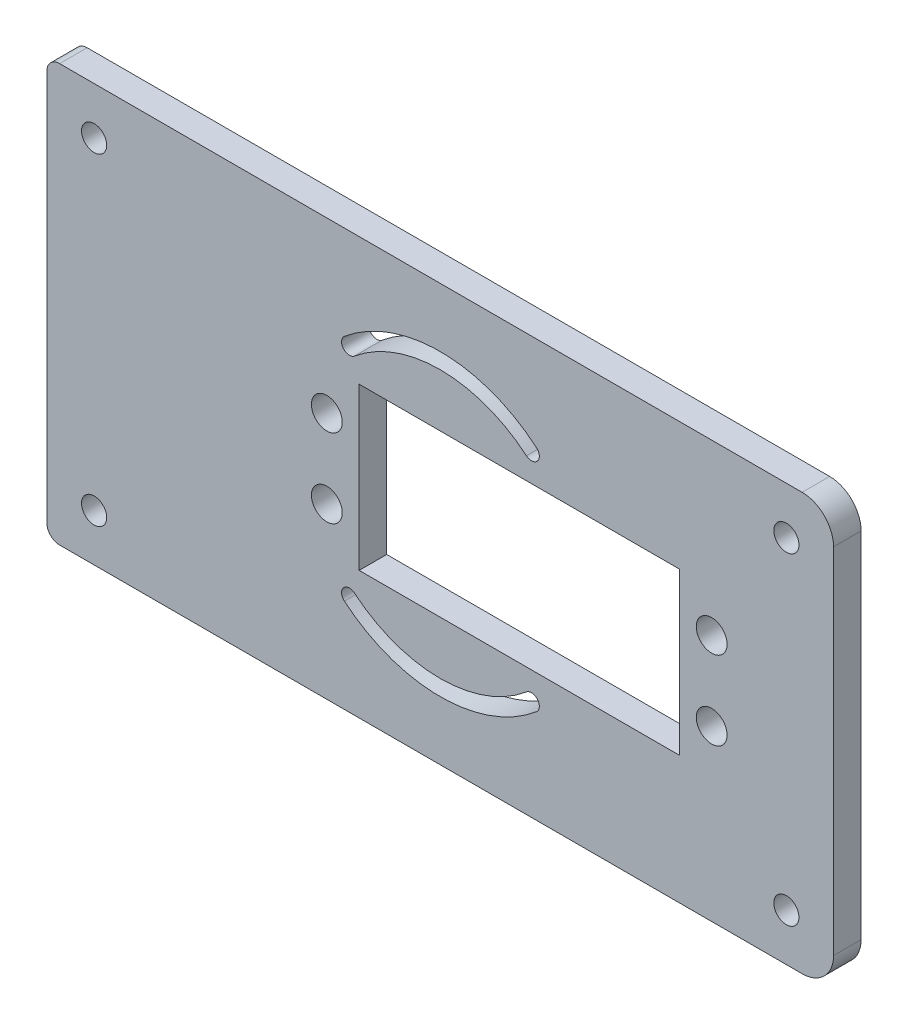
ISO-10303-21;
HEADER;
FILE_DESCRIPTION(('STEP AP214'),'2;1');
FILE_NAME('part.step','',(''),(''),'','','');
FILE_SCHEMA(('AUTOMOTIVE_DESIGN { 1 0 10303 214 1 1 1 1 }'));
ENDSEC;
DATA;
#1=APPLICATION_CONTEXT('core data for automotive mechanical design processes');
#2=APPLICATION_PROTOCOL_DEFINITION('international standard','automotive_design',2000,#1);
#3=PRODUCT_CONTEXT('',#1,'mechanical');
#4=PRODUCT('Part','Part','',(#3));
#5=PRODUCT_RELATED_PRODUCT_CATEGORY('part','',(#4));
#6=PRODUCT_DEFINITION_FORMATION('','',#4);
#7=PRODUCT_DEFINITION_CONTEXT('part definition',#1,'design');
#8=PRODUCT_DEFINITION('design','',#6,#7);
#9=PRODUCT_DEFINITION_SHAPE('','',#8);
#10=(LENGTH_UNIT() NAMED_UNIT(*) SI_UNIT(.MILLI.,.METRE.));
#11=(NAMED_UNIT(*) PLANE_ANGLE_UNIT() SI_UNIT($,.RADIAN.));
#12=(NAMED_UNIT(*) SI_UNIT($,.STERADIAN.) SOLID_ANGLE_UNIT());
#13=UNCERTAINTY_MEASURE_WITH_UNIT(LENGTH_MEASURE(1.E-05),#10,'distance_accuracy_value','');
#14=(GEOMETRIC_REPRESENTATION_CONTEXT(3) GLOBAL_UNCERTAINTY_ASSIGNED_CONTEXT((#13)) GLOBAL_UNIT_ASSIGNED_CONTEXT((#10,
#11,#12)) REPRESENTATION_CONTEXT('',''));
#15=CARTESIAN_POINT('',(0.,0.,0.));
#16=DIRECTION('',(0.,0.,1.));
#17=DIRECTION('',(1.,0.,0.));
#18=AXIS2_PLACEMENT_3D('',#15,#16,#17);
#19=CARTESIAN_POINT('',(-0.0442005485762831,0.,3.5));
#20=DIRECTION('',(0.,0.,-1.));
#21=DIRECTION('',(-1.,0.,0.));
#22=AXIS2_PLACEMENT_3D('',#19,#20,#21);
#23=CYLINDRICAL_SURFACE('',#22,19.);
#24=CARTESIAN_POINT('',(-0.0442005485762831,0.,0.));
#25=DIRECTION('',(0.,0.,1.));
#26=DIRECTION('',(1.,0.,0.));
#27=AXIS2_PLACEMENT_3D('',#24,#25,#26);
#28=CIRCLE('',#27,19.);
#29=CARTESIAN_POINT('',(-12.2297645811815,14.5777923296801,0.));
#30=VERTEX_POINT('',#29);
#31=CARTESIAN_POINT('',(12.1961213713889,14.5318450065922,0.));
#32=VERTEX_POINT('',#31);
#33=EDGE_CURVE('E274',#30,#32,#28,.F.);
#34=ORIENTED_EDGE('',*,*,#33,.T.);
#35=DIRECTION('',(0.,0.,-1.));
#36=VECTOR('',#35,1.);
#37=CARTESIAN_POINT('',(12.1961213713889,14.5318450065922,3.5));
#38=LINE('',#37,#36);
#39=CARTESIAN_POINT('',(12.1961213713889,14.5318450065922,3.5));
#40=VERTEX_POINT('',#39);
#41=EDGE_CURVE('E11',#40,#32,#38,.T.);
#42=ORIENTED_EDGE('',*,*,#41,.F.);
#43=CARTESIAN_POINT('',(-0.0442005485762831,0.,3.5));
#44=DIRECTION('',(0.,0.,1.));
#45=DIRECTION('',(1.,0.,0.));
#46=AXIS2_PLACEMENT_3D('',#43,#44,#45);
#47=CIRCLE('',#46,19.);
#48=CARTESIAN_POINT('',(-12.2297645811815,14.5777923296801,3.5));
#49=VERTEX_POINT('',#48);
#50=EDGE_CURVE('E185',#49,#40,#47,.F.);
#51=ORIENTED_EDGE('',*,*,#50,.F.);
#52=DIRECTION('',(0.,0.,-1.));
#53=VECTOR('',#52,1.);
#54=CARTESIAN_POINT('',(-12.2297645811815,14.5777923296801,3.5));
#55=LINE('',#54,#53);
#56=EDGE_CURVE('E288',#49,#30,#55,.T.);
#57=ORIENTED_EDGE('',*,*,#56,.T.);
#58=EDGE_LOOP('',(#34,#42,#51,#57));
#59=FACE_BOUND('',#58,.T.);
#60=ADVANCED_FACE('F35',(#59),#23,.F.);
#61=CARTESIAN_POINT('',(11.5518939019171,13.7670110588768,3.5));
#62=DIRECTION('',(0.,0.,-1.));
#63=DIRECTION('',(-1.,0.,0.));
#64=AXIS2_PLACEMENT_3D('',#61,#62,#63);
#65=CYLINDRICAL_SURFACE('',#64,1.00000000000001);
#66=CARTESIAN_POINT('',(11.5518939019171,13.7670110588768,0.));
#67=DIRECTION('',(0.,0.,1.));
#68=DIRECTION('',(1.,0.,0.));
#69=AXIS2_PLACEMENT_3D('',#66,#67,#68);
#70=CIRCLE('',#69,1.00000000000001);
#71=CARTESIAN_POINT('',(10.9076664324452,13.0021771111615,0.));
#72=VERTEX_POINT('',#71);
#73=EDGE_CURVE('E191',#32,#72,#70,.F.);
#74=ORIENTED_EDGE('',*,*,#73,.T.);
#75=DIRECTION('',(0.,0.,-1.));
#76=VECTOR('',#75,1.);
#77=CARTESIAN_POINT('',(10.9076664324452,13.0021771111615,3.5));
#78=LINE('',#77,#76);
#79=CARTESIAN_POINT('',(10.9076664324452,13.0021771111615,3.5));
#80=VERTEX_POINT('',#79);
#81=EDGE_CURVE('E45',#80,#72,#78,.T.);
#82=ORIENTED_EDGE('',*,*,#81,.F.);
#83=CARTESIAN_POINT('',(11.5518939019171,13.7670110588768,3.5));
#84=DIRECTION('',(0.,0.,1.));
#85=DIRECTION('',(1.,0.,0.));
#86=AXIS2_PLACEMENT_3D('',#83,#84,#85);
#87=CIRCLE('',#86,1.00000000000001);
#88=EDGE_CURVE('E178',#40,#80,#87,.F.);
#89=ORIENTED_EDGE('',*,*,#88,.F.);
#90=ORIENTED_EDGE('',*,*,#41,.T.);
#91=EDGE_LOOP('',(#74,#82,#89,#90));
#92=FACE_BOUND('',#91,.T.);
#93=ADVANCED_FACE('F190',(#92),#65,.F.);
#94=CARTESIAN_POINT('',(-0.0442005485762831,0.,3.5));
#95=DIRECTION('',(0.,0.,-1.));
#96=DIRECTION('',(-1.,0.,0.));
#97=AXIS2_PLACEMENT_3D('',#94,#95,#96);
#98=CYLINDRICAL_SURFACE('',#97,17.);
#99=CARTESIAN_POINT('',(-0.0442005485762831,0.,0.));
#100=DIRECTION('',(0.,0.,1.));
#101=DIRECTION('',(1.,0.,0.));
#102=AXIS2_PLACEMENT_3D('',#99,#100,#101);
#103=CIRCLE('',#102,17.);
#104=CARTESIAN_POINT('',(-10.9470736303809,13.0432878739243,0.));
#105=VERTEX_POINT('',#104);
#106=EDGE_CURVE('E278',#105,#72,#103,.F.);
#107=ORIENTED_EDGE('',*,*,#106,.F.);
#108=DIRECTION('',(0.,0.,-1.));
#109=VECTOR('',#108,1.);
#110=CARTESIAN_POINT('',(-10.9470736303809,13.0432878739243,3.5));
#111=LINE('',#110,#109);
#112=CARTESIAN_POINT('',(-10.9470736303809,13.0432878739243,3.5));
#113=VERTEX_POINT('',#112);
#114=EDGE_CURVE('E118',#113,#105,#111,.T.);
#115=ORIENTED_EDGE('',*,*,#114,.F.);
#116=CARTESIAN_POINT('',(-0.0442005485762831,0.,3.5));
#117=DIRECTION('',(0.,0.,1.));
#118=DIRECTION('',(1.,0.,0.));
#119=AXIS2_PLACEMENT_3D('',#116,#117,#118);
#120=CIRCLE('',#119,17.);
#121=EDGE_CURVE('E183',#113,#80,#120,.F.);
#122=ORIENTED_EDGE('',*,*,#121,.T.);
#123=ORIENTED_EDGE('',*,*,#81,.T.);
#124=EDGE_LOOP('',(#107,#115,#122,#123));
#125=FACE_BOUND('',#124,.T.);
#126=ADVANCED_FACE('F196',(#125),#98,.T.);
#127=CARTESIAN_POINT('',(0.,10.24910129856,3.5));
#128=DIRECTION('',(0.,1.,0.));
#129=DIRECTION('',(0.,0.,1.));
#130=AXIS2_PLACEMENT_3D('',#127,#128,#129);
#131=PLANE('',#130);
#132=DIRECTION('',(1.,0.,0.));
#133=VECTOR('',#132,1.);
#134=CARTESIAN_POINT('',(0.,10.24910129856,0.));
#135=LINE('',#134,#133);
#136=CARTESIAN_POINT('',(-10.349101298564,10.24910129856,0.));
#137=VERTEX_POINT('',#136);
#138=CARTESIAN_POINT('',(30.34910129856,10.24910129856,0.));
#139=VERTEX_POINT('',#138);
#140=EDGE_CURVE('E262',#137,#139,#135,.T.);
#141=ORIENTED_EDGE('',*,*,#140,.T.);
#142=DIRECTION('',(0.,0.,-1.));
#143=VECTOR('',#142,1.);
#144=CARTESIAN_POINT('',(30.34910129856,10.24910129856,3.5));
#145=LINE('',#144,#143);
#146=CARTESIAN_POINT('',(30.34910129856,10.24910129856,3.5));
#147=VERTEX_POINT('',#146);
#148=EDGE_CURVE('E290',#147,#139,#145,.T.);
#149=ORIENTED_EDGE('',*,*,#148,.F.);
#150=DIRECTION('',(1.,0.,0.));
#151=VECTOR('',#150,1.);
#152=CARTESIAN_POINT('',(0.,10.24910129856,3.5));
#153=LINE('',#152,#151);
#154=CARTESIAN_POINT('',(-10.349101298564,10.24910129856,3.5));
#155=VERTEX_POINT('',#154);
#156=EDGE_CURVE('E384',#155,#147,#153,.T.);
#157=ORIENTED_EDGE('',*,*,#156,.F.);
#158=DIRECTION('',(0.,0.,-1.));
#159=VECTOR('',#158,1.);
#160=CARTESIAN_POINT('',(-10.349101298564,10.24910129856,3.5));
#161=LINE('',#160,#159);
#162=EDGE_CURVE('E292',#155,#137,#161,.T.);
#163=ORIENTED_EDGE('',*,*,#162,.T.);
#164=EDGE_LOOP('',(#141,#149,#157,#163));
#165=FACE_BOUND('',#164,.T.);
#166=ADVANCED_FACE('F410',(#165),#131,.F.);
#167=CARTESIAN_POINT('',(30.34910129856,0.,3.5));
#168=DIRECTION('',(1.,0.,0.));
#169=DIRECTION('',(0.,0.,-1.));
#170=AXIS2_PLACEMENT_3D('',#167,#168,#169);
#171=PLANE('',#170);
#172=DIRECTION('',(0.,-1.,0.));
#173=VECTOR('',#172,1.);
#174=CARTESIAN_POINT('',(30.34910129856,0.,0.));
#175=LINE('',#174,#173);
#176=CARTESIAN_POINT('',(30.34910129856,-10.249101298564,0.));
#177=VERTEX_POINT('',#176);
#178=EDGE_CURVE('E265',#139,#177,#175,.T.);
#179=ORIENTED_EDGE('',*,*,#178,.T.);
#180=DIRECTION('',(0.,0.,-1.));
#181=VECTOR('',#180,1.);
#182=CARTESIAN_POINT('',(30.34910129856,-10.249101298564,3.5));
#183=LINE('',#182,#181);
#184=CARTESIAN_POINT('',(30.34910129856,-10.249101298564,3.5));
#185=VERTEX_POINT('',#184);
#186=EDGE_CURVE('E297',#185,#177,#183,.T.);
#187=ORIENTED_EDGE('',*,*,#186,.F.);
#188=DIRECTION('',(0.,-1.,0.));
#189=VECTOR('',#188,1.);
#190=CARTESIAN_POINT('',(30.34910129856,0.,3.5));
#191=LINE('',#190,#189);
#192=EDGE_CURVE('E387',#147,#185,#191,.T.);
#193=ORIENTED_EDGE('',*,*,#192,.F.);
#194=ORIENTED_EDGE('',*,*,#148,.T.);
#195=EDGE_LOOP('',(#179,#187,#193,#194));
#196=FACE_BOUND('',#195,.T.);
#197=ADVANCED_FACE('F412',(#196),#171,.F.);
#198=CARTESIAN_POINT('',(0.,-10.249101298564,3.5));
#199=DIRECTION('',(0.,1.,0.));
#200=DIRECTION('',(0.,0.,1.));
#201=AXIS2_PLACEMENT_3D('',#198,#199,#200);
#202=PLANE('',#201);
#203=DIRECTION('',(1.,0.,0.));
#204=VECTOR('',#203,1.);
#205=CARTESIAN_POINT('',(0.,-10.249101298564,0.));
#206=LINE('',#205,#204);
#207=CARTESIAN_POINT('',(-10.349101298564,-10.249101298564,0.));
#208=VERTEX_POINT('',#207);
#209=EDGE_CURVE('E268',#208,#177,#206,.T.);
#210=ORIENTED_EDGE('',*,*,#209,.F.);
#211=DIRECTION('',(0.,0.,-1.));
#212=VECTOR('',#211,1.);
#213=CARTESIAN_POINT('',(-10.349101298564,-10.249101298564,3.5));
#214=LINE('',#213,#212);
#215=CARTESIAN_POINT('',(-10.349101298564,-10.249101298564,3.5));
#216=VERTEX_POINT('',#215);
#217=EDGE_CURVE('E294',#216,#208,#214,.T.);
#218=ORIENTED_EDGE('',*,*,#217,.F.);
#219=DIRECTION('',(1.,0.,0.));
#220=VECTOR('',#219,1.);
#221=CARTESIAN_POINT('',(0.,-10.249101298564,3.5));
#222=LINE('',#221,#220);
#223=EDGE_CURVE('E389',#216,#185,#222,.T.);
#224=ORIENTED_EDGE('',*,*,#223,.T.);
#225=ORIENTED_EDGE('',*,*,#186,.T.);
#226=EDGE_LOOP('',(#210,#218,#224,#225));
#227=FACE_BOUND('',#226,.T.);
#228=ADVANCED_FACE('F405',(#227),#202,.T.);
#229=CARTESIAN_POINT('',(11.5518939019171,-13.7670110588768,3.5));
#230=DIRECTION('',(0.,0.,-1.));
#231=DIRECTION('',(-1.,0.,0.));
#232=AXIS2_PLACEMENT_3D('',#229,#230,#231);
#233=CYLINDRICAL_SURFACE('',#232,1.);
#234=CARTESIAN_POINT('',(11.5518939019171,-13.7670110588768,0.));
#235=DIRECTION('',(0.,0.,1.));
#236=DIRECTION('',(1.,0.,0.));
#237=AXIS2_PLACEMENT_3D('',#234,#235,#236);
#238=CIRCLE('',#237,1.);
#239=CARTESIAN_POINT('',(12.1961213713889,-14.5318450065922,0.));
#240=VERTEX_POINT('',#239);
#241=CARTESIAN_POINT('',(10.9076664324452,-13.0021771111615,0.));
#242=VERTEX_POINT('',#241);
#243=EDGE_CURVE('E238',#240,#242,#238,.T.);
#244=ORIENTED_EDGE('',*,*,#243,.F.);
#245=DIRECTION('',(0.,0.,-1.));
#246=VECTOR('',#245,1.);
#247=CARTESIAN_POINT('',(12.1961213713889,-14.5318450065922,3.5));
#248=LINE('',#247,#246);
#249=CARTESIAN_POINT('',(12.1961213713889,-14.5318450065922,3.5));
#250=VERTEX_POINT('',#249);
#251=EDGE_CURVE('E295',#250,#240,#248,.T.);
#252=ORIENTED_EDGE('',*,*,#251,.F.);
#253=CARTESIAN_POINT('',(11.5518939019171,-13.7670110588768,3.5));
#254=DIRECTION('',(0.,0.,1.));
#255=DIRECTION('',(1.,0.,0.));
#256=AXIS2_PLACEMENT_3D('',#253,#254,#255);
#257=CIRCLE('',#256,1.);
#258=CARTESIAN_POINT('',(10.9076664324452,-13.0021771111615,3.5));
#259=VERTEX_POINT('',#258);
#260=EDGE_CURVE('E361',#250,#259,#257,.T.);
#261=ORIENTED_EDGE('',*,*,#260,.T.);
#262=DIRECTION('',(0.,0.,-1.));
#263=VECTOR('',#262,1.);
#264=CARTESIAN_POINT('',(10.9076664324452,-13.0021771111615,3.5));
#265=LINE('',#264,#263);
#266=EDGE_CURVE('E301',#259,#242,#265,.T.);
#267=ORIENTED_EDGE('',*,*,#266,.T.);
#268=EDGE_LOOP('',(#244,#252,#261,#267));
#269=FACE_BOUND('',#268,.T.);
#270=ADVANCED_FACE('F419',(#269),#233,.F.);
#271=CARTESIAN_POINT('',(-0.0442005485762831,0.,3.5));
#272=DIRECTION('',(0.,0.,-1.));
#273=DIRECTION('',(-1.,0.,0.));
#274=AXIS2_PLACEMENT_3D('',#271,#272,#273);
#275=CYLINDRICAL_SURFACE('',#274,19.);
#276=CARTESIAN_POINT('',(-0.0442005485762831,0.,0.));
#277=DIRECTION('',(0.,0.,1.));
#278=DIRECTION('',(1.,0.,0.));
#279=AXIS2_PLACEMENT_3D('',#276,#277,#278);
#280=CIRCLE('',#279,19.);
#281=CARTESIAN_POINT('',(-12.2297645811815,-14.5777923296801,0.));
#282=VERTEX_POINT('',#281);
#283=EDGE_CURVE('E241',#282,#240,#280,.T.);
#284=ORIENTED_EDGE('',*,*,#283,.F.);
#285=DIRECTION('',(0.,0.,-1.));
#286=VECTOR('',#285,1.);
#287=CARTESIAN_POINT('',(-12.2297645811815,-14.5777923296801,3.5));
#288=LINE('',#287,#286);
#289=CARTESIAN_POINT('',(-12.2297645811815,-14.5777923296801,3.5));
#290=VERTEX_POINT('',#289);
#291=EDGE_CURVE('E305',#290,#282,#288,.T.);
#292=ORIENTED_EDGE('',*,*,#291,.F.);
#293=CARTESIAN_POINT('',(-0.0442005485762831,0.,3.5));
#294=DIRECTION('',(0.,0.,1.));
#295=DIRECTION('',(1.,0.,0.));
#296=AXIS2_PLACEMENT_3D('',#293,#294,#295);
#297=CIRCLE('',#296,19.);
#298=EDGE_CURVE('E364',#290,#250,#297,.T.);
#299=ORIENTED_EDGE('',*,*,#298,.T.);
#300=ORIENTED_EDGE('',*,*,#251,.T.);
#301=EDGE_LOOP('',(#284,#292,#299,#300));
#302=FACE_BOUND('',#301,.T.);
#303=ADVANCED_FACE('F478',(#302),#275,.F.);
#304=CARTESIAN_POINT('',(-11.5884191057812,-13.8105401018022,3.5));
#305=DIRECTION('',(0.,0.,-1.));
#306=DIRECTION('',(-1.,0.,0.));
#307=AXIS2_PLACEMENT_3D('',#304,#305,#306);
#308=CYLINDRICAL_SURFACE('',#307,1.);
#309=CARTESIAN_POINT('',(-11.5884191057812,-13.8105401018022,0.));
#310=DIRECTION('',(0.,0.,1.));
#311=DIRECTION('',(1.,0.,0.));
#312=AXIS2_PLACEMENT_3D('',#309,#310,#311);
#313=CIRCLE('',#312,1.);
#314=CARTESIAN_POINT('',(-10.9470736303809,-13.0432878739243,0.));
#315=VERTEX_POINT('',#314);
#316=EDGE_CURVE('E244',#315,#282,#313,.T.);
#317=ORIENTED_EDGE('',*,*,#316,.F.);
#318=DIRECTION('',(0.,0.,-1.));
#319=VECTOR('',#318,1.);
#320=CARTESIAN_POINT('',(-10.9470736303809,-13.0432878739243,3.5));
#321=LINE('',#320,#319);
#322=CARTESIAN_POINT('',(-10.9470736303809,-13.0432878739243,3.5));
#323=VERTEX_POINT('',#322);
#324=EDGE_CURVE('E303',#323,#315,#321,.T.);
#325=ORIENTED_EDGE('',*,*,#324,.F.);
#326=CARTESIAN_POINT('',(-11.5884191057812,-13.8105401018022,3.5));
#327=DIRECTION('',(0.,0.,1.));
#328=DIRECTION('',(1.,0.,0.));
#329=AXIS2_PLACEMENT_3D('',#326,#327,#328);
#330=CIRCLE('',#329,1.);
#331=EDGE_CURVE('E367',#323,#290,#330,.T.);
#332=ORIENTED_EDGE('',*,*,#331,.T.);
#333=ORIENTED_EDGE('',*,*,#291,.T.);
#334=EDGE_LOOP('',(#317,#325,#332,#333));
#335=FACE_BOUND('',#334,.T.);
#336=ADVANCED_FACE('F488',(#335),#308,.F.);
#337=CARTESIAN_POINT('',(45.9557994514237,-22.5,3.5));
#338=DIRECTION('',(0.,0.,-1.));
#339=DIRECTION('',(-1.,0.,0.));
#340=AXIS2_PLACEMENT_3D('',#337,#338,#339);
#341=CYLINDRICAL_SURFACE('',#340,4.);
#342=CARTESIAN_POINT('',(45.9557994514237,-22.5,0.));
#343=DIRECTION('',(0.,0.,1.));
#344=DIRECTION('',(1.,0.,0.));
#345=AXIS2_PLACEMENT_3D('',#342,#343,#344);
#346=CIRCLE('',#345,4.);
#347=CARTESIAN_POINT('',(49.9557994514237,-22.5,0.));
#348=VERTEX_POINT('',#347);
#349=CARTESIAN_POINT('',(45.9557994514237,-26.5,0.));
#350=VERTEX_POINT('',#349);
#351=EDGE_CURVE('E214',#348,#350,#346,.F.);
#352=ORIENTED_EDGE('',*,*,#351,.F.);
#353=DIRECTION('',(0.,0.,-1.));
#354=VECTOR('',#353,1.);
#355=CARTESIAN_POINT('',(49.9557994514237,-22.5,3.5));
#356=LINE('',#355,#354);
#357=CARTESIAN_POINT('',(49.9557994514237,-22.5,3.5));
#358=VERTEX_POINT('',#357);
#359=EDGE_CURVE('E39',#358,#348,#356,.T.);
#360=ORIENTED_EDGE('',*,*,#359,.F.);
#361=CARTESIAN_POINT('',(45.9557994514237,-22.5,3.5));
#362=DIRECTION('',(0.,0.,1.));
#363=DIRECTION('',(1.,0.,0.));
#364=AXIS2_PLACEMENT_3D('',#361,#362,#363);
#365=CIRCLE('',#364,4.);
#366=CARTESIAN_POINT('',(45.9557994514237,-26.5,3.5));
#367=VERTEX_POINT('',#366);
#368=EDGE_CURVE('E687',#358,#367,#365,.F.);
#369=ORIENTED_EDGE('',*,*,#368,.T.);
#370=DIRECTION('',(0.,0.,-1.));
#371=VECTOR('',#370,1.);
#372=CARTESIAN_POINT('',(45.9557994514237,-26.5,3.5));
#373=LINE('',#372,#371);
#374=EDGE_CURVE('E207',#367,#350,#373,.T.);
#375=ORIENTED_EDGE('',*,*,#374,.T.);
#376=EDGE_LOOP('',(#352,#360,#369,#375));
#377=FACE_BOUND('',#376,.T.);
#378=ADVANCED_FACE('F328',(#377),#341,.T.);
#379=CARTESIAN_POINT('',(49.9557994514237,0.,3.5));
#380=DIRECTION('',(1.,0.,0.));
#381=DIRECTION('',(0.,1.,0.));
#382=AXIS2_PLACEMENT_3D('',#379,#380,#381);
#383=PLANE('',#382);
#384=DIRECTION('',(0.,-1.,0.));
#385=VECTOR('',#384,1.);
#386=CARTESIAN_POINT('',(49.9557994514237,0.,0.));
#387=LINE('',#386,#385);
#388=CARTESIAN_POINT('',(49.9557994514237,22.5,0.));
#389=VERTEX_POINT('',#388);
#390=EDGE_CURVE('E217',#389,#348,#387,.T.);
#391=ORIENTED_EDGE('',*,*,#390,.F.);
#392=DIRECTION('',(0.,0.,-1.));
#393=VECTOR('',#392,1.);
#394=CARTESIAN_POINT('',(49.9557994514237,22.5,3.5));
#395=LINE('',#394,#393);
#396=CARTESIAN_POINT('',(49.9557994514237,22.5,3.5));
#397=VERTEX_POINT('',#396);
#398=EDGE_CURVE('E318',#397,#389,#395,.T.);
#399=ORIENTED_EDGE('',*,*,#398,.F.);
#400=DIRECTION('',(0.,-1.,0.));
#401=VECTOR('',#400,1.);
#402=CARTESIAN_POINT('',(49.9557994514237,0.,3.5));
#403=LINE('',#402,#401);
#404=EDGE_CURVE('E327',#397,#358,#403,.T.);
#405=ORIENTED_EDGE('',*,*,#404,.T.);
#406=ORIENTED_EDGE('',*,*,#359,.T.);
#407=EDGE_LOOP('',(#391,#399,#405,#406));
#408=FACE_BOUND('',#407,.T.);
#409=ADVANCED_FACE('F325',(#408),#383,.T.);
#410=CARTESIAN_POINT('',(45.9557994514237,22.5,3.5));
#411=DIRECTION('',(0.,0.,-1.));
#412=DIRECTION('',(-1.,0.,0.));
#413=AXIS2_PLACEMENT_3D('',#410,#411,#412);
#414=CYLINDRICAL_SURFACE('',#413,4.);
#415=CARTESIAN_POINT('',(45.9557994514237,22.5,0.));
#416=DIRECTION('',(0.,0.,1.));
#417=DIRECTION('',(1.,0.,0.));
#418=AXIS2_PLACEMENT_3D('',#415,#416,#417);
#419=CIRCLE('',#418,4.);
#420=CARTESIAN_POINT('',(45.9557994514237,26.5,0.));
#421=VERTEX_POINT('',#420);
#422=EDGE_CURVE('E220',#421,#389,#419,.F.);
#423=ORIENTED_EDGE('',*,*,#422,.F.);
#424=DIRECTION('',(0.,0.,-1.));
#425=VECTOR('',#424,1.);
#426=CARTESIAN_POINT('',(45.9557994514237,26.5,3.5));
#427=LINE('',#426,#425);
#428=CARTESIAN_POINT('',(45.9557994514237,26.5,3.5));
#429=VERTEX_POINT('',#428);
#430=EDGE_CURVE('E317',#429,#421,#427,.T.);
#431=ORIENTED_EDGE('',*,*,#430,.F.);
#432=CARTESIAN_POINT('',(45.9557994514237,22.5,3.5));
#433=DIRECTION('',(0.,0.,1.));
#434=DIRECTION('',(1.,0.,0.));
#435=AXIS2_PLACEMENT_3D('',#432,#433,#434);
#436=CIRCLE('',#435,4.);
#437=EDGE_CURVE('E338',#429,#397,#436,.F.);
#438=ORIENTED_EDGE('',*,*,#437,.T.);
#439=ORIENTED_EDGE('',*,*,#398,.T.);
#440=EDGE_LOOP('',(#423,#431,#438,#439));
#441=FACE_BOUND('',#440,.T.);
#442=ADVANCED_FACE('F336',(#441),#414,.T.);
#443=CARTESIAN_POINT('',(0.,26.5,3.5));
#444=DIRECTION('',(0.,1.,0.));
#445=DIRECTION('',(0.,0.,1.));
#446=AXIS2_PLACEMENT_3D('',#443,#444,#445);
#447=PLANE('',#446);
#448=DIRECTION('',(1.,0.,0.));
#449=VECTOR('',#448,1.);
#450=CARTESIAN_POINT('',(0.,26.5,0.));
#451=LINE('',#450,#449);
#452=CARTESIAN_POINT('',(-48.4290015311776,26.5,0.));
#453=VERTEX_POINT('',#452);
#454=EDGE_CURVE('E223',#453,#421,#451,.T.);
#455=ORIENTED_EDGE('',*,*,#454,.F.);
#456=DIRECTION('',(0.,0.,-1.));
#457=VECTOR('',#456,1.);
#458=CARTESIAN_POINT('',(-48.4290015311776,26.5,3.5));
#459=LINE('',#458,#457);
#460=CARTESIAN_POINT('',(-48.4290015311776,26.5,3.5));
#461=VERTEX_POINT('',#460);
#462=EDGE_CURVE('E315',#461,#453,#459,.T.);
#463=ORIENTED_EDGE('',*,*,#462,.F.);
#464=DIRECTION('',(1.,0.,0.));
#465=VECTOR('',#464,1.);
#466=CARTESIAN_POINT('',(0.,26.5,3.5));
#467=LINE('',#466,#465);
#468=EDGE_CURVE('E344',#461,#429,#467,.T.);
#469=ORIENTED_EDGE('',*,*,#468,.T.);
#470=ORIENTED_EDGE('',*,*,#430,.T.);
#471=EDGE_LOOP('',(#455,#463,#469,#470));
#472=FACE_BOUND('',#471,.T.);
#473=ADVANCED_FACE('F346',(#472),#447,.T.);
#474=CARTESIAN_POINT('',(-48.4290015311776,24.8848009826013,3.5));
#475=DIRECTION('',(0.,0.,-1.));
#476=DIRECTION('',(-1.,0.,0.));
#477=AXIS2_PLACEMENT_3D('',#474,#475,#476);
#478=CYLINDRICAL_SURFACE('',#477,1.61519901739871);
#479=CARTESIAN_POINT('',(-48.4290015311776,24.8848009826013,0.));
#480=DIRECTION('',(0.,0.,1.));
#481=DIRECTION('',(1.,0.,0.));
#482=AXIS2_PLACEMENT_3D('',#479,#480,#481);
#483=CIRCLE('',#482,1.61519901739871);
#484=CARTESIAN_POINT('',(-50.0442005485763,24.8848009826013,0.));
#485=VERTEX_POINT('',#484);
#486=EDGE_CURVE('E226',#453,#485,#483,.T.);
#487=ORIENTED_EDGE('',*,*,#486,.T.);
#488=DIRECTION('',(0.,0.,-1.));
#489=VECTOR('',#488,1.);
#490=CARTESIAN_POINT('',(-50.0442005485763,24.8848009826013,3.5));
#491=LINE('',#490,#489);
#492=CARTESIAN_POINT('',(-50.0442005485763,24.8848009826013,3.5));
#493=VERTEX_POINT('',#492);
#494=EDGE_CURVE('E313',#493,#485,#491,.T.);
#495=ORIENTED_EDGE('',*,*,#494,.F.);
#496=CARTESIAN_POINT('',(-48.4290015311776,24.8848009826013,3.5));
#497=DIRECTION('',(0.,0.,1.));
#498=DIRECTION('',(1.,0.,0.));
#499=AXIS2_PLACEMENT_3D('',#496,#497,#498);
#500=CIRCLE('',#499,1.61519901739871);
#501=EDGE_CURVE('E348',#461,#493,#500,.T.);
#502=ORIENTED_EDGE('',*,*,#501,.F.);
#503=ORIENTED_EDGE('',*,*,#462,.T.);
#504=EDGE_LOOP('',(#487,#495,#502,#503));
#505=FACE_BOUND('',#504,.T.);
#506=ADVANCED_FACE('F531',(#505),#478,.T.);
#507=CARTESIAN_POINT('',(-50.0442005485763,0.,3.5));
#508=DIRECTION('',(-1.,0.,0.));
#509=DIRECTION('',(0.,-1.,0.));
#510=AXIS2_PLACEMENT_3D('',#507,#508,#509);
#511=PLANE('',#510);
#512=DIRECTION('',(0.,1.,0.));
#513=VECTOR('',#512,1.);
#514=CARTESIAN_POINT('',(-50.0442005485763,0.,0.));
#515=LINE('',#514,#513);
#516=CARTESIAN_POINT('',(-50.0442005485763,-24.8848009826013,0.));
#517=VERTEX_POINT('',#516);
#518=EDGE_CURVE('E229',#517,#485,#515,.T.);
#519=ORIENTED_EDGE('',*,*,#518,.F.);
#520=DIRECTION('',(0.,0.,-1.));
#521=VECTOR('',#520,1.);
#522=CARTESIAN_POINT('',(-50.0442005485763,-24.8848009826013,3.5));
#523=LINE('',#522,#521);
#524=CARTESIAN_POINT('',(-50.0442005485763,-24.8848009826013,3.5));
#525=VERTEX_POINT('',#524);
#526=EDGE_CURVE('E311',#525,#517,#523,.T.);
#527=ORIENTED_EDGE('',*,*,#526,.F.);
#528=DIRECTION('',(0.,1.,0.));
#529=VECTOR('',#528,1.);
#530=CARTESIAN_POINT('',(-50.0442005485763,0.,3.5));
#531=LINE('',#530,#529);
#532=EDGE_CURVE('E350',#525,#493,#531,.T.);
#533=ORIENTED_EDGE('',*,*,#532,.T.);
#534=ORIENTED_EDGE('',*,*,#494,.T.);
#535=EDGE_LOOP('',(#519,#527,#533,#534));
#536=FACE_BOUND('',#535,.T.);
#537=ADVANCED_FACE('F540',(#536),#511,.T.);
#538=CARTESIAN_POINT('',(-48.4290015311776,-24.8848009826013,3.5));
#539=DIRECTION('',(0.,0.,-1.));
#540=DIRECTION('',(-1.,0.,0.));
#541=AXIS2_PLACEMENT_3D('',#538,#539,#540);
#542=CYLINDRICAL_SURFACE('',#541,1.61519901739871);
#543=CARTESIAN_POINT('',(-48.4290015311776,-24.8848009826013,0.));
#544=DIRECTION('',(0.,0.,1.));
#545=DIRECTION('',(1.,0.,0.));
#546=AXIS2_PLACEMENT_3D('',#543,#544,#545);
#547=CIRCLE('',#546,1.61519901739871);
#548=CARTESIAN_POINT('',(-48.4290015311776,-26.5,0.));
#549=VERTEX_POINT('',#548);
#550=EDGE_CURVE('E232',#549,#517,#547,.F.);
#551=ORIENTED_EDGE('',*,*,#550,.F.);
#552=DIRECTION('',(0.,0.,-1.));
#553=VECTOR('',#552,1.);
#554=CARTESIAN_POINT('',(-48.4290015311776,-26.5,3.5));
#555=LINE('',#554,#553);
#556=CARTESIAN_POINT('',(-48.4290015311776,-26.5,3.5));
#557=VERTEX_POINT('',#556);
#558=EDGE_CURVE('E309',#557,#549,#555,.T.);
#559=ORIENTED_EDGE('',*,*,#558,.F.);
#560=CARTESIAN_POINT('',(-48.4290015311776,-24.8848009826013,3.5));
#561=DIRECTION('',(0.,0.,1.));
#562=DIRECTION('',(1.,0.,0.));
#563=AXIS2_PLACEMENT_3D('',#560,#561,#562);
#564=CIRCLE('',#563,1.61519901739871);
#565=EDGE_CURVE('E356',#557,#525,#564,.F.);
#566=ORIENTED_EDGE('',*,*,#565,.T.);
#567=ORIENTED_EDGE('',*,*,#526,.T.);
#568=EDGE_LOOP('',(#551,#559,#566,#567));
#569=FACE_BOUND('',#568,.T.);
#570=ADVANCED_FACE('F446',(#569),#542,.T.);
#571=CARTESIAN_POINT('',(34.4620886384427,-5.,3.5));
#572=DIRECTION('',(0.,0.,-1.));
#573=DIRECTION('',(-1.,0.,0.));
#574=AXIS2_PLACEMENT_3D('',#571,#572,#573);
#575=CYLINDRICAL_SURFACE('',#574,1.96133809798307);
#576=CARTESIAN_POINT('',(34.4620886384427,-5.,3.5));
#577=DIRECTION('',(0.,0.,1.));
#578=DIRECTION('',(1.,0.,0.));
#579=AXIS2_PLACEMENT_3D('',#576,#577,#578);
#580=CIRCLE('',#579,1.96133809798307);
#581=CARTESIAN_POINT('',(36.4234267364258,-5.,3.5));
#582=VERTEX_POINT('',#581);
#583=EDGE_CURVE('E198',#582,#582,#580,.T.);
#584=ORIENTED_EDGE('',*,*,#583,.T.);
#585=EDGE_LOOP('',(#584));
#586=FACE_BOUND('',#585,.T.);
#587=CARTESIAN_POINT('',(34.4620886384427,-5.,0.));
#588=DIRECTION('',(0.,0.,1.));
#589=DIRECTION('',(1.,0.,0.));
#590=AXIS2_PLACEMENT_3D('',#587,#588,#589);
#591=CIRCLE('',#590,1.96133809798307);
#592=CARTESIAN_POINT('',(36.4234267364258,-5.,0.));
#593=VERTEX_POINT('',#592);
#594=EDGE_CURVE('E281',#593,#593,#591,.T.);
#595=ORIENTED_EDGE('',*,*,#594,.F.);
#596=EDGE_LOOP('',(#595));
#597=FACE_BOUND('',#596,.T.);
#598=ADVANCED_FACE('F441',(#586,#597),#575,.F.);
#599=CARTESIAN_POINT('',(-11.5884191057812,13.8105401018022,3.5));
#600=DIRECTION('',(0.,0.,-1.));
#601=DIRECTION('',(-1.,0.,0.));
#602=AXIS2_PLACEMENT_3D('',#599,#600,#601);
#603=CYLINDRICAL_SURFACE('',#602,0.999999999999996);
#604=CARTESIAN_POINT('',(-11.5884191057812,13.8105401018022,0.));
#605=DIRECTION('',(0.,0.,1.));
#606=DIRECTION('',(1.,0.,0.));
#607=AXIS2_PLACEMENT_3D('',#604,#605,#606);
#608=CIRCLE('',#607,0.999999999999996);
#609=EDGE_CURVE('E121',#105,#30,#608,.F.);
#610=ORIENTED_EDGE('',*,*,#609,.T.);
#611=ORIENTED_EDGE('',*,*,#56,.F.);
#612=CARTESIAN_POINT('',(-11.5884191057812,13.8105401018022,3.5));
#613=DIRECTION('',(0.,0.,1.));
#614=DIRECTION('',(1.,0.,0.));
#615=AXIS2_PLACEMENT_3D('',#612,#613,#614);
#616=CIRCLE('',#615,0.999999999999996);
#617=EDGE_CURVE('E54',#113,#49,#616,.F.);
#618=ORIENTED_EDGE('',*,*,#617,.F.);
#619=ORIENTED_EDGE('',*,*,#114,.T.);
#620=EDGE_LOOP('',(#610,#611,#618,#619));
#621=FACE_BOUND('',#620,.T.);
#622=ADVANCED_FACE('F433',(#621),#603,.F.);
#623=CARTESIAN_POINT('',(-10.349101298564,0.,3.5));
#624=DIRECTION('',(1.,0.,0.));
#625=DIRECTION('',(0.,0.,-1.));
#626=AXIS2_PLACEMENT_3D('',#623,#624,#625);
#627=PLANE('',#626);
#628=DIRECTION('',(0.,-1.,0.));
#629=VECTOR('',#628,1.);
#630=CARTESIAN_POINT('',(-10.349101298564,0.,0.));
#631=LINE('',#630,#629);
#632=EDGE_CURVE('E271',#137,#208,#631,.T.);
#633=ORIENTED_EDGE('',*,*,#632,.F.);
#634=ORIENTED_EDGE('',*,*,#162,.F.);
#635=DIRECTION('',(0.,-1.,0.));
#636=VECTOR('',#635,1.);
#637=CARTESIAN_POINT('',(-10.349101298564,0.,3.5));
#638=LINE('',#637,#636);
#639=EDGE_CURVE('E392',#155,#216,#638,.T.);
#640=ORIENTED_EDGE('',*,*,#639,.T.);
#641=ORIENTED_EDGE('',*,*,#217,.T.);
#642=EDGE_LOOP('',(#633,#634,#640,#641));
#643=FACE_BOUND('',#642,.T.);
#644=ADVANCED_FACE('F397',(#643),#627,.T.);
#645=CARTESIAN_POINT('',(43.9557994514237,-20.5,3.5));
#646=DIRECTION('',(0.,0.,-1.));
#647=DIRECTION('',(-1.,0.,0.));
#648=AXIS2_PLACEMENT_3D('',#645,#646,#647);
#649=CYLINDRICAL_SURFACE('',#648,1.6);
#650=CARTESIAN_POINT('',(43.9557994514237,-20.5,3.5));
#651=DIRECTION('',(0.,0.,1.));
#652=DIRECTION('',(1.,0.,0.));
#653=AXIS2_PLACEMENT_3D('',#650,#651,#652);
#654=CIRCLE('',#653,1.6);
#655=CARTESIAN_POINT('',(45.5557994514237,-20.5,3.5));
#656=VERTEX_POINT('',#655);
#657=EDGE_CURVE('E381',#656,#656,#654,.T.);
#658=ORIENTED_EDGE('',*,*,#657,.T.);
#659=EDGE_LOOP('',(#658));
#660=FACE_BOUND('',#659,.T.);
#661=CARTESIAN_POINT('',(43.9557994514237,-20.5,0.));
#662=DIRECTION('',(0.,0.,1.));
#663=DIRECTION('',(1.,0.,0.));
#664=AXIS2_PLACEMENT_3D('',#661,#662,#663);
#665=CIRCLE('',#664,1.6);
#666=CARTESIAN_POINT('',(45.5557994514237,-20.5,0.));
#667=VERTEX_POINT('',#666);
#668=EDGE_CURVE('E259',#667,#667,#665,.T.);
#669=ORIENTED_EDGE('',*,*,#668,.F.);
#670=EDGE_LOOP('',(#669));
#671=FACE_BOUND('',#670,.T.);
#672=ADVANCED_FACE('F432',(#660,#671),#649,.F.);
#673=CARTESIAN_POINT('',(43.9557994514237,20.5,3.5));
#674=DIRECTION('',(0.,0.,-1.));
#675=DIRECTION('',(-1.,0.,0.));
#676=AXIS2_PLACEMENT_3D('',#673,#674,#675);
#677=CYLINDRICAL_SURFACE('',#676,1.6);
#678=CARTESIAN_POINT('',(43.9557994514237,20.5,3.5));
#679=DIRECTION('',(0.,0.,1.));
#680=DIRECTION('',(1.,0.,0.));
#681=AXIS2_PLACEMENT_3D('',#678,#679,#680);
#682=CIRCLE('',#681,1.6);
#683=CARTESIAN_POINT('',(45.5557994514237,20.5,3.5));
#684=VERTEX_POINT('',#683);
#685=EDGE_CURVE('E378',#684,#684,#682,.T.);
#686=ORIENTED_EDGE('',*,*,#685,.T.);
#687=EDGE_LOOP('',(#686));
#688=FACE_BOUND('',#687,.T.);
#689=CARTESIAN_POINT('',(43.9557994514237,20.5,0.));
#690=DIRECTION('',(0.,0.,1.));
#691=DIRECTION('',(1.,0.,0.));
#692=AXIS2_PLACEMENT_3D('',#689,#690,#691);
#693=CIRCLE('',#692,1.6);
#694=CARTESIAN_POINT('',(45.5557994514237,20.5,0.));
#695=VERTEX_POINT('',#694);
#696=EDGE_CURVE('E256',#695,#695,#693,.T.);
#697=ORIENTED_EDGE('',*,*,#696,.F.);
#698=EDGE_LOOP('',(#697));
#699=FACE_BOUND('',#698,.T.);
#700=ADVANCED_FACE('F438',(#688,#699),#677,.F.);
#701=CARTESIAN_POINT('',(-44.0442005485763,20.5,3.5));
#702=DIRECTION('',(0.,0.,-1.));
#703=DIRECTION('',(-1.,0.,0.));
#704=AXIS2_PLACEMENT_3D('',#701,#702,#703);
#705=CYLINDRICAL_SURFACE('',#704,1.6);
#706=CARTESIAN_POINT('',(-44.0442005485763,20.5,3.5));
#707=DIRECTION('',(0.,0.,1.));
#708=DIRECTION('',(1.,0.,0.));
#709=AXIS2_PLACEMENT_3D('',#706,#707,#708);
#710=CIRCLE('',#709,1.6);
#711=CARTESIAN_POINT('',(-42.4442005485763,20.5,3.5));
#712=VERTEX_POINT('',#711);
#713=EDGE_CURVE('E375',#712,#712,#710,.T.);
#714=ORIENTED_EDGE('',*,*,#713,.T.);
#715=EDGE_LOOP('',(#714));
#716=FACE_BOUND('',#715,.T.);
#717=CARTESIAN_POINT('',(-44.0442005485763,20.5,0.));
#718=DIRECTION('',(0.,0.,1.));
#719=DIRECTION('',(1.,0.,0.));
#720=AXIS2_PLACEMENT_3D('',#717,#718,#719);
#721=CIRCLE('',#720,1.6);
#722=CARTESIAN_POINT('',(-42.4442005485763,20.5,0.));
#723=VERTEX_POINT('',#722);
#724=EDGE_CURVE('E253',#723,#723,#721,.T.);
#725=ORIENTED_EDGE('',*,*,#724,.F.);
#726=EDGE_LOOP('',(#725));
#727=FACE_BOUND('',#726,.T.);
#728=ADVANCED_FACE('F588',(#716,#727),#705,.F.);
#729=CARTESIAN_POINT('',(-44.0442005485763,-20.5,3.5));
#730=DIRECTION('',(0.,0.,-1.));
#731=DIRECTION('',(-1.,0.,0.));
#732=AXIS2_PLACEMENT_3D('',#729,#730,#731);
#733=CYLINDRICAL_SURFACE('',#732,1.6);
#734=CARTESIAN_POINT('',(-44.0442005485763,-20.5,3.5));
#735=DIRECTION('',(0.,0.,1.));
#736=DIRECTION('',(1.,0.,0.));
#737=AXIS2_PLACEMENT_3D('',#734,#735,#736);
#738=CIRCLE('',#737,1.6);
#739=CARTESIAN_POINT('',(-42.4442005485763,-20.5,3.5));
#740=VERTEX_POINT('',#739);
#741=EDGE_CURVE('E372',#740,#740,#738,.T.);
#742=ORIENTED_EDGE('',*,*,#741,.T.);
#743=EDGE_LOOP('',(#742));
#744=FACE_BOUND('',#743,.T.);
#745=CARTESIAN_POINT('',(-44.0442005485763,-20.5,0.));
#746=DIRECTION('',(0.,0.,1.));
#747=DIRECTION('',(1.,0.,0.));
#748=AXIS2_PLACEMENT_3D('',#745,#746,#747);
#749=CIRCLE('',#748,1.6);
#750=CARTESIAN_POINT('',(-42.4442005485763,-20.5,0.));
#751=VERTEX_POINT('',#750);
#752=EDGE_CURVE('E250',#751,#751,#749,.T.);
#753=ORIENTED_EDGE('',*,*,#752,.F.);
#754=EDGE_LOOP('',(#753));
#755=FACE_BOUND('',#754,.T.);
#756=ADVANCED_FACE('F598',(#744,#755),#733,.F.);
#757=CARTESIAN_POINT('',(-0.0442005485762831,0.,3.5));
#758=DIRECTION('',(0.,0.,-1.));
#759=DIRECTION('',(-1.,0.,0.));
#760=AXIS2_PLACEMENT_3D('',#757,#758,#759);
#761=CYLINDRICAL_SURFACE('',#760,17.);
#762=CARTESIAN_POINT('',(-0.0442005485762831,0.,0.));
#763=DIRECTION('',(0.,0.,1.));
#764=DIRECTION('',(1.,0.,0.));
#765=AXIS2_PLACEMENT_3D('',#762,#763,#764);
#766=CIRCLE('',#765,17.);
#767=EDGE_CURVE('E247',#315,#242,#766,.T.);
#768=ORIENTED_EDGE('',*,*,#767,.T.);
#769=ORIENTED_EDGE('',*,*,#266,.F.);
#770=CARTESIAN_POINT('',(-0.0442005485762831,0.,3.5));
#771=DIRECTION('',(0.,0.,1.));
#772=DIRECTION('',(1.,0.,0.));
#773=AXIS2_PLACEMENT_3D('',#770,#771,#772);
#774=CIRCLE('',#773,17.);
#775=EDGE_CURVE('E370',#323,#259,#774,.T.);
#776=ORIENTED_EDGE('',*,*,#775,.F.);
#777=ORIENTED_EDGE('',*,*,#324,.T.);
#778=EDGE_LOOP('',(#768,#769,#776,#777));
#779=FACE_BOUND('',#778,.T.);
#780=ADVANCED_FACE('F608',(#779),#761,.T.);
#781=CARTESIAN_POINT('',(0.,-26.5,3.5));
#782=DIRECTION('',(0.,1.,0.));
#783=DIRECTION('',(-1.,0.,0.));
#784=AXIS2_PLACEMENT_3D('',#781,#782,#783);
#785=PLANE('',#784);
#786=DIRECTION('',(1.,0.,0.));
#787=VECTOR('',#786,1.);
#788=CARTESIAN_POINT('',(0.,-26.5,0.));
#789=LINE('',#788,#787);
#790=EDGE_CURVE('E235',#549,#350,#789,.T.);
#791=ORIENTED_EDGE('',*,*,#790,.T.);
#792=ORIENTED_EDGE('',*,*,#374,.F.);
#793=DIRECTION('',(1.,0.,0.));
#794=VECTOR('',#793,1.);
#795=CARTESIAN_POINT('',(0.,-26.5,3.5));
#796=LINE('',#795,#794);
#797=EDGE_CURVE('E359',#557,#367,#796,.T.);
#798=ORIENTED_EDGE('',*,*,#797,.F.);
#799=ORIENTED_EDGE('',*,*,#558,.T.);
#800=EDGE_LOOP('',(#791,#792,#798,#799));
#801=FACE_BOUND('',#800,.T.);
#802=ADVANCED_FACE('F618',(#801),#785,.F.);
#803=CARTESIAN_POINT('',(-14.4620886384467,5.,3.5));
#804=DIRECTION('',(0.,0.,-1.));
#805=DIRECTION('',(-1.,0.,0.));
#806=AXIS2_PLACEMENT_3D('',#803,#804,#805);
#807=CYLINDRICAL_SURFACE('',#806,1.96133809798308);
#808=CARTESIAN_POINT('',(-14.4620886384467,5.,3.5));
#809=DIRECTION('',(0.,0.,1.));
#810=DIRECTION('',(1.,0.,0.));
#811=AXIS2_PLACEMENT_3D('',#808,#809,#810);
#812=CIRCLE('',#811,1.96133809798308);
#813=CARTESIAN_POINT('',(-12.5007505404637,5.,3.5));
#814=VERTEX_POINT('',#813);
#815=EDGE_CURVE('E686',#814,#814,#812,.T.);
#816=ORIENTED_EDGE('',*,*,#815,.T.);
#817=EDGE_LOOP('',(#816));
#818=FACE_BOUND('',#817,.T.);
#819=CARTESIAN_POINT('',(-14.4620886384467,5.,0.));
#820=DIRECTION('',(0.,0.,1.));
#821=DIRECTION('',(1.,0.,0.));
#822=AXIS2_PLACEMENT_3D('',#819,#820,#821);
#823=CIRCLE('',#822,1.96133809798308);
#824=CARTESIAN_POINT('',(-12.5007505404637,5.,0.));
#825=VERTEX_POINT('',#824);
#826=EDGE_CURVE('E211',#825,#825,#823,.T.);
#827=ORIENTED_EDGE('',*,*,#826,.F.);
#828=EDGE_LOOP('',(#827));
#829=FACE_BOUND('',#828,.T.);
#830=ADVANCED_FACE('F628',(#818,#829),#807,.F.);
#831=CARTESIAN_POINT('',(-14.4620886384467,-5.,3.5));
#832=DIRECTION('',(0.,0.,-1.));
#833=DIRECTION('',(-1.,0.,0.));
#834=AXIS2_PLACEMENT_3D('',#831,#832,#833);
#835=CYLINDRICAL_SURFACE('',#834,1.96133809798308);
#836=CARTESIAN_POINT('',(-14.4620886384467,-5.,3.5));
#837=DIRECTION('',(0.,0.,1.));
#838=DIRECTION('',(1.,0.,0.));
#839=AXIS2_PLACEMENT_3D('',#836,#837,#838);
#840=CIRCLE('',#839,1.96133809798308);
#841=CARTESIAN_POINT('',(-12.5007505404637,-5.,3.5));
#842=VERTEX_POINT('',#841);
#843=EDGE_CURVE('E287',#842,#842,#840,.F.);
#844=ORIENTED_EDGE('',*,*,#843,.F.);
#845=EDGE_LOOP('',(#844));
#846=FACE_BOUND('',#845,.T.);
#847=CARTESIAN_POINT('',(-14.4620886384467,-5.,0.));
#848=DIRECTION('',(0.,0.,1.));
#849=DIRECTION('',(1.,0.,0.));
#850=AXIS2_PLACEMENT_3D('',#847,#848,#849);
#851=CIRCLE('',#850,1.96133809798308);
#852=CARTESIAN_POINT('',(-12.5007505404637,-5.,0.));
#853=VERTEX_POINT('',#852);
#854=EDGE_CURVE('E208',#853,#853,#851,.F.);
#855=ORIENTED_EDGE('',*,*,#854,.T.);
#856=EDGE_LOOP('',(#855));
#857=FACE_BOUND('',#856,.T.);
#858=ADVANCED_FACE('F37',(#846,#857),#835,.F.);
#859=CARTESIAN_POINT('',(34.4620886384427,5.,3.5));
#860=DIRECTION('',(0.,0.,-1.));
#861=DIRECTION('',(-1.,0.,0.));
#862=AXIS2_PLACEMENT_3D('',#859,#860,#861);
#863=CYLINDRICAL_SURFACE('',#862,1.96133809798308);
#864=CARTESIAN_POINT('',(34.4620886384427,5.,3.5));
#865=DIRECTION('',(0.,0.,1.));
#866=DIRECTION('',(1.,0.,0.));
#867=AXIS2_PLACEMENT_3D('',#864,#865,#866);
#868=CIRCLE('',#867,1.96133809798308);
#869=CARTESIAN_POINT('',(36.4234267364258,5.,3.5));
#870=VERTEX_POINT('',#869);
#871=EDGE_CURVE('E204',#870,#870,#868,.F.);
#872=ORIENTED_EDGE('',*,*,#871,.F.);
#873=EDGE_LOOP('',(#872));
#874=FACE_BOUND('',#873,.T.);
#875=CARTESIAN_POINT('',(34.4620886384427,5.,0.));
#876=DIRECTION('',(0.,0.,1.));
#877=DIRECTION('',(1.,0.,0.));
#878=AXIS2_PLACEMENT_3D('',#875,#876,#877);
#879=CIRCLE('',#878,1.96133809798308);
#880=CARTESIAN_POINT('',(36.4234267364258,5.,0.));
#881=VERTEX_POINT('',#880);
#882=EDGE_CURVE('E284',#881,#881,#879,.F.);
#883=ORIENTED_EDGE('',*,*,#882,.T.);
#884=EDGE_LOOP('',(#883));
#885=FACE_BOUND('',#884,.T.);
#886=ADVANCED_FACE('F646',(#874,#885),#863,.F.);
#887=CARTESIAN_POINT('',(0.,0.,3.5));
#888=DIRECTION('',(0.,0.,1.));
#889=DIRECTION('',(1.,0.,0.));
#890=AXIS2_PLACEMENT_3D('',#887,#888,#889);
#891=PLANE('',#890);
#892=ORIENTED_EDGE('',*,*,#843,.T.);
#893=EDGE_LOOP('',(#892));
#894=FACE_BOUND('',#893,.T.);
#895=ORIENTED_EDGE('',*,*,#815,.F.);
#896=EDGE_LOOP('',(#895));
#897=FACE_BOUND('',#896,.T.);
#898=ORIENTED_EDGE('',*,*,#368,.F.);
#899=ORIENTED_EDGE('',*,*,#404,.F.);
#900=ORIENTED_EDGE('',*,*,#437,.F.);
#901=ORIENTED_EDGE('',*,*,#468,.F.);
#902=ORIENTED_EDGE('',*,*,#501,.T.);
#903=ORIENTED_EDGE('',*,*,#532,.F.);
#904=ORIENTED_EDGE('',*,*,#565,.F.);
#905=ORIENTED_EDGE('',*,*,#797,.T.);
#906=EDGE_LOOP('',(#898,#899,#900,#901,#902,#903,#904,#905));
#907=FACE_BOUND('',#906,.T.);
#908=ORIENTED_EDGE('',*,*,#260,.F.);
#909=ORIENTED_EDGE('',*,*,#298,.F.);
#910=ORIENTED_EDGE('',*,*,#331,.F.);
#911=ORIENTED_EDGE('',*,*,#775,.T.);
#912=EDGE_LOOP('',(#908,#909,#910,#911));
#913=FACE_BOUND('',#912,.T.);
#914=ORIENTED_EDGE('',*,*,#741,.F.);
#915=EDGE_LOOP('',(#914));
#916=FACE_BOUND('',#915,.T.);
#917=ORIENTED_EDGE('',*,*,#713,.F.);
#918=EDGE_LOOP('',(#917));
#919=FACE_BOUND('',#918,.T.);
#920=ORIENTED_EDGE('',*,*,#685,.F.);
#921=EDGE_LOOP('',(#920));
#922=FACE_BOUND('',#921,.T.);
#923=ORIENTED_EDGE('',*,*,#657,.F.);
#924=EDGE_LOOP('',(#923));
#925=FACE_BOUND('',#924,.T.);
#926=ORIENTED_EDGE('',*,*,#156,.T.);
#927=ORIENTED_EDGE('',*,*,#192,.T.);
#928=ORIENTED_EDGE('',*,*,#223,.F.);
#929=ORIENTED_EDGE('',*,*,#639,.F.);
#930=EDGE_LOOP('',(#926,#927,#928,#929));
#931=FACE_BOUND('',#930,.T.);
#932=ORIENTED_EDGE('',*,*,#50,.T.);
#933=ORIENTED_EDGE('',*,*,#88,.T.);
#934=ORIENTED_EDGE('',*,*,#121,.F.);
#935=ORIENTED_EDGE('',*,*,#617,.T.);
#936=EDGE_LOOP('',(#932,#933,#934,#935));
#937=FACE_BOUND('',#936,.T.);
#938=ORIENTED_EDGE('',*,*,#583,.F.);
#939=EDGE_LOOP('',(#938));
#940=FACE_BOUND('',#939,.T.);
#941=ORIENTED_EDGE('',*,*,#871,.T.);
#942=EDGE_LOOP('',(#941));
#943=FACE_BOUND('',#942,.T.);
#944=ADVANCED_FACE('F180',(#894,#897,#907,#913,#916,#919,#922,#925,#931,#937,#940,#943),#891,.T.);
#945=CARTESIAN_POINT('',(0.,0.,0.));
#946=DIRECTION('',(0.,0.,1.));
#947=DIRECTION('',(1.,0.,0.));
#948=AXIS2_PLACEMENT_3D('',#945,#946,#947);
#949=PLANE('',#948);
#950=ORIENTED_EDGE('',*,*,#854,.F.);
#951=EDGE_LOOP('',(#950));
#952=FACE_BOUND('',#951,.T.);
#953=ORIENTED_EDGE('',*,*,#826,.T.);
#954=EDGE_LOOP('',(#953));
#955=FACE_BOUND('',#954,.T.);
#956=ORIENTED_EDGE('',*,*,#351,.T.);
#957=ORIENTED_EDGE('',*,*,#790,.F.);
#958=ORIENTED_EDGE('',*,*,#550,.T.);
#959=ORIENTED_EDGE('',*,*,#518,.T.);
#960=ORIENTED_EDGE('',*,*,#486,.F.);
#961=ORIENTED_EDGE('',*,*,#454,.T.);
#962=ORIENTED_EDGE('',*,*,#422,.T.);
#963=ORIENTED_EDGE('',*,*,#390,.T.);
#964=EDGE_LOOP('',(#956,#957,#958,#959,#960,#961,#962,#963));
#965=FACE_BOUND('',#964,.T.);
#966=ORIENTED_EDGE('',*,*,#243,.T.);
#967=ORIENTED_EDGE('',*,*,#767,.F.);
#968=ORIENTED_EDGE('',*,*,#316,.T.);
#969=ORIENTED_EDGE('',*,*,#283,.T.);
#970=EDGE_LOOP('',(#966,#967,#968,#969));
#971=FACE_BOUND('',#970,.T.);
#972=ORIENTED_EDGE('',*,*,#752,.T.);
#973=EDGE_LOOP('',(#972));
#974=FACE_BOUND('',#973,.T.);
#975=ORIENTED_EDGE('',*,*,#724,.T.);
#976=EDGE_LOOP('',(#975));
#977=FACE_BOUND('',#976,.T.);
#978=ORIENTED_EDGE('',*,*,#696,.T.);
#979=EDGE_LOOP('',(#978));
#980=FACE_BOUND('',#979,.T.);
#981=ORIENTED_EDGE('',*,*,#668,.T.);
#982=EDGE_LOOP('',(#981));
#983=FACE_BOUND('',#982,.T.);
#984=ORIENTED_EDGE('',*,*,#140,.F.);
#985=ORIENTED_EDGE('',*,*,#632,.T.);
#986=ORIENTED_EDGE('',*,*,#209,.T.);
#987=ORIENTED_EDGE('',*,*,#178,.F.);
#988=EDGE_LOOP('',(#984,#985,#986,#987));
#989=FACE_BOUND('',#988,.T.);
#990=ORIENTED_EDGE('',*,*,#33,.F.);
#991=ORIENTED_EDGE('',*,*,#609,.F.);
#992=ORIENTED_EDGE('',*,*,#106,.T.);
#993=ORIENTED_EDGE('',*,*,#73,.F.);
#994=EDGE_LOOP('',(#990,#991,#992,#993));
#995=FACE_BOUND('',#994,.T.);
#996=ORIENTED_EDGE('',*,*,#594,.T.);
#997=EDGE_LOOP('',(#996));
#998=FACE_BOUND('',#997,.T.);
#999=ORIENTED_EDGE('',*,*,#882,.F.);
#1000=EDGE_LOOP('',(#999));
#1001=FACE_BOUND('',#1000,.T.);
#1002=ADVANCED_FACE('F332',(#952,#955,#965,#971,#974,#977,#980,#983,#989,#995,#998,#1001),#949,.F.);
#1003=CLOSED_SHELL('',(#60,#93,#126,#166,#197,#228,#270,#303,#336,#378,#409,#442,#473,#506,#537,
#570,#598,#622,#644,#672,#700,#728,#756,#780,#802,#830,#858,#886,#944,#1002));
#1004=MANIFOLD_SOLID_BREP('B2',#1003);
#1005=ADVANCED_BREP_SHAPE_REPRESENTATION('',(#18,#1004),#14);
#1006=SHAPE_DEFINITION_REPRESENTATION(#9,#1005);
ENDSEC;
END-ISO-10303-21;
